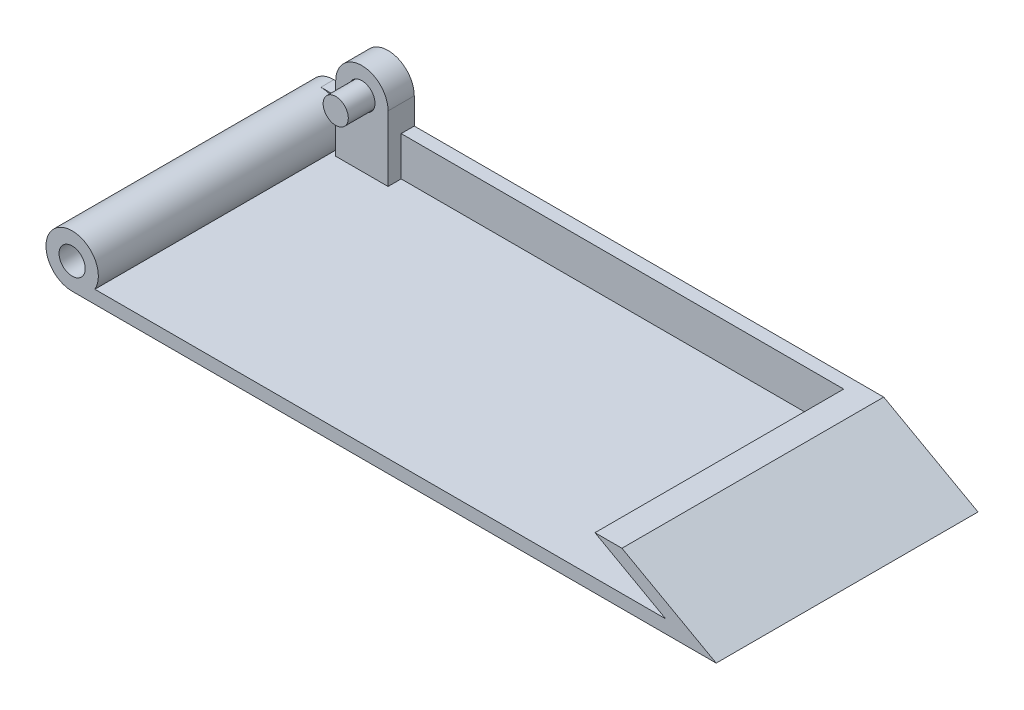
ISO-10303-21;
HEADER;
FILE_DESCRIPTION(('STEP AP214'),'2;1');
FILE_NAME('part.step','',(''),(''),'','','');
FILE_SCHEMA(('AUTOMOTIVE_DESIGN { 1 0 10303 214 1 1 1 1 }'));
ENDSEC;
DATA;
#1=APPLICATION_CONTEXT('core data for automotive mechanical design processes');
#2=APPLICATION_PROTOCOL_DEFINITION('international standard','automotive_design',2000,#1);
#3=PRODUCT_CONTEXT('',#1,'mechanical');
#4=PRODUCT('Part','Part','',(#3));
#5=PRODUCT_RELATED_PRODUCT_CATEGORY('part','',(#4));
#6=PRODUCT_DEFINITION_FORMATION('','',#4);
#7=PRODUCT_DEFINITION_CONTEXT('part definition',#1,'design');
#8=PRODUCT_DEFINITION('design','',#6,#7);
#9=PRODUCT_DEFINITION_SHAPE('','',#8);
#10=(LENGTH_UNIT() NAMED_UNIT(*) SI_UNIT(.MILLI.,.METRE.));
#11=(NAMED_UNIT(*) PLANE_ANGLE_UNIT() SI_UNIT($,.RADIAN.));
#12=(NAMED_UNIT(*) SI_UNIT($,.STERADIAN.) SOLID_ANGLE_UNIT());
#13=UNCERTAINTY_MEASURE_WITH_UNIT(LENGTH_MEASURE(1.E-05),#10,'distance_accuracy_value','');
#14=(GEOMETRIC_REPRESENTATION_CONTEXT(3) GLOBAL_UNCERTAINTY_ASSIGNED_CONTEXT((#13)) GLOBAL_UNIT_ASSIGNED_CONTEXT((#10,
#11,#12)) REPRESENTATION_CONTEXT('',''));
#15=CARTESIAN_POINT('',(0.,0.,0.));
#16=DIRECTION('',(0.,0.,1.));
#17=DIRECTION('',(1.,0.,0.));
#18=AXIS2_PLACEMENT_3D('',#15,#16,#17);
#19=CARTESIAN_POINT('',(10.3363442521382,10.,10.));
#20=DIRECTION('',(0.,0.,1.));
#21=DIRECTION('',(1.,0.,0.));
#22=AXIS2_PLACEMENT_3D('',#19,#20,#21);
#23=PLANE('',#22);
#24=CARTESIAN_POINT('',(10.3363442521382,10.,10.));
#25=DIRECTION('',(0.,0.,-1.));
#26=DIRECTION('',(1.,0.,0.));
#27=AXIS2_PLACEMENT_3D('',#24,#25,#26);
#28=CIRCLE('',#27,2.4);
#29=CARTESIAN_POINT('',(7.93634425213825,10.,10.));
#30=VERTEX_POINT('',#29);
#31=EDGE_CURVE('P0_E21',#30,#30,#28,.T.);
#32=ORIENTED_EDGE('',*,*,#31,.F.);
#33=EDGE_LOOP('',(#32));
#34=FACE_BOUND('',#33,.T.);
#35=ADVANCED_FACE('P0_F17',(#34),#23,.T.);
#36=CARTESIAN_POINT('',(10.3363442521382,10.,0.));
#37=DIRECTION('',(0.,0.,1.));
#38=DIRECTION('',(1.,0.,0.));
#39=AXIS2_PLACEMENT_3D('',#36,#37,#38);
#40=PLANE('',#39);
#41=CARTESIAN_POINT('',(10.3363442521382,10.,0.));
#42=DIRECTION('',(0.,0.,1.));
#43=DIRECTION('',(1.,0.,0.));
#44=AXIS2_PLACEMENT_3D('',#41,#42,#43);
#45=CIRCLE('',#44,2.4);
#46=CARTESIAN_POINT('',(7.93634425213825,10.,0.));
#47=VERTEX_POINT('',#46);
#48=EDGE_CURVE('P0_E11',#47,#47,#45,.T.);
#49=ORIENTED_EDGE('',*,*,#48,.F.);
#50=EDGE_LOOP('',(#49));
#51=FACE_BOUND('',#50,.T.);
#52=ADVANCED_FACE('P0_F55',(#51),#40,.F.);
#53=CARTESIAN_POINT('',(10.3363442521382,10.,0.));
#54=DIRECTION('',(0.,0.,1.));
#55=DIRECTION('',(1.,0.,0.));
#56=AXIS2_PLACEMENT_3D('',#53,#54,#55);
#57=CYLINDRICAL_SURFACE('',#56,2.4);
#58=ORIENTED_EDGE('',*,*,#48,.T.);
#59=EDGE_LOOP('',(#58));
#60=FACE_BOUND('',#59,.T.);
#61=ORIENTED_EDGE('',*,*,#31,.T.);
#62=EDGE_LOOP('',(#61));
#63=FACE_BOUND('',#62,.T.);
#64=ADVANCED_FACE('P0_F19',(#60,#63),#57,.T.);
#65=CLOSED_SHELL('',(#35,#52,#64));
#66=MANIFOLD_SOLID_BREP('P0_B1',#65);
#67=CARTESIAN_POINT('',(59.,0.,50.));
#68=DIRECTION('',(0.,0.,1.));
#69=DIRECTION('',(1.,0.,0.));
#70=AXIS2_PLACEMENT_3D('',#67,#68,#69);
#71=PLANE('',#70);
#72=CARTESIAN_POINT('',(0.,0.,50.));
#73=DIRECTION('',(0.,0.,-1.));
#74=DIRECTION('',(-1.,0.,0.));
#75=AXIS2_PLACEMENT_3D('',#72,#73,#74);
#76=CIRCLE('',#75,2.5);
#77=CARTESIAN_POINT('',(2.5,0.,50.));
#78=VERTEX_POINT('',#77);
#79=EDGE_CURVE('P1_E10',#78,#78,#76,.T.);
#80=ORIENTED_EDGE('',*,*,#79,.T.);
#81=EDGE_LOOP('',(#80));
#82=FACE_BOUND('',#81,.T.);
#83=CARTESIAN_POINT('',(0.,0.,50.));
#84=DIRECTION('',(0.,0.,1.));
#85=DIRECTION('',(-0.86602540378444,0.5,0.));
#86=AXIS2_PLACEMENT_3D('',#83,#84,#85);
#87=CIRCLE('',#86,5.);
#88=CARTESIAN_POINT('',(4.3301270189222,-2.5,50.));
#89=VERTEX_POINT('',#88);
#90=CARTESIAN_POINT('',(0.,-5.,50.));
#91=VERTEX_POINT('',#90);
#92=EDGE_CURVE('P1_E248',#89,#91,#87,.T.);
#93=ORIENTED_EDGE('',*,*,#92,.T.);
#94=DIRECTION('',(-1.,0.,0.));
#95=VECTOR('',#94,1.);
#96=CARTESIAN_POINT('',(123.,-5.,50.));
#97=LINE('',#96,#95);
#98=CARTESIAN_POINT('',(123.,-5.,50.));
#99=VERTEX_POINT('',#98);
#100=EDGE_CURVE('P1_E292',#99,#91,#97,.T.);
#101=ORIENTED_EDGE('',*,*,#100,.F.);
#102=DIRECTION('',(-0.874157276121538,0.485642931178632,0.));
#103=VECTOR('',#102,1.);
#104=CARTESIAN_POINT('',(123.,-5.,50.));
#105=LINE('',#104,#103);
#106=CARTESIAN_POINT('',(105.,5.,50.));
#107=VERTEX_POINT('',#106);
#108=EDGE_CURVE('P1_E200',#99,#107,#105,.T.);
#109=ORIENTED_EDGE('',*,*,#108,.T.);
#110=DIRECTION('',(1.,0.,0.));
#111=VECTOR('',#110,1.);
#112=CARTESIAN_POINT('',(99.8521849295065,5.,50.));
#113=LINE('',#112,#111);
#114=CARTESIAN_POINT('',(99.8521849295065,5.,50.));
#115=VERTEX_POINT('',#114);
#116=EDGE_CURVE('P1_E213',#115,#107,#113,.T.);
#117=ORIENTED_EDGE('',*,*,#116,.F.);
#118=DIRECTION('',(0.874157276121538,-0.485642931178632,0.));
#119=VECTOR('',#118,1.);
#120=CARTESIAN_POINT('',(99.8521849295065,5.,50.));
#121=LINE('',#120,#119);
#122=CARTESIAN_POINT('',(113.352184929506,-2.5,50.));
#123=VERTEX_POINT('',#122);
#124=EDGE_CURVE('P1_E293',#115,#123,#121,.T.);
#125=ORIENTED_EDGE('',*,*,#124,.T.);
#126=DIRECTION('',(-1.,0.,0.));
#127=VECTOR('',#126,1.);
#128=CARTESIAN_POINT('',(113.352184929506,-2.5,50.));
#129=LINE('',#128,#127);
#130=EDGE_CURVE('P1_E235',#123,#89,#129,.T.);
#131=ORIENTED_EDGE('',*,*,#130,.T.);
#132=EDGE_LOOP('',(#93,#101,#109,#117,#125,#131));
#133=FACE_BOUND('',#132,.T.);
#134=ADVANCED_FACE('P1_F16',(#82,#133),#71,.T.);
#135=CARTESIAN_POINT('',(0.,0.,0.));
#136=DIRECTION('',(0.,0.,1.));
#137=DIRECTION('',(-1.,0.,0.));
#138=AXIS2_PLACEMENT_3D('',#135,#136,#137);
#139=CYLINDRICAL_SURFACE('',#138,2.5);
#140=CARTESIAN_POINT('',(0.,0.,0.));
#141=DIRECTION('',(0.,0.,1.));
#142=DIRECTION('',(-1.,0.,0.));
#143=AXIS2_PLACEMENT_3D('',#140,#141,#142);
#144=CIRCLE('',#143,2.5);
#145=CARTESIAN_POINT('',(2.5,0.,0.));
#146=VERTEX_POINT('',#145);
#147=EDGE_CURVE('P1_E240',#146,#146,#144,.T.);
#148=ORIENTED_EDGE('',*,*,#147,.F.);
#149=EDGE_LOOP('',(#148));
#150=FACE_BOUND('',#149,.T.);
#151=ORIENTED_EDGE('',*,*,#79,.F.);
#152=EDGE_LOOP('',(#151));
#153=FACE_BOUND('',#152,.T.);
#154=ADVANCED_FACE('P1_F487',(#150,#153),#139,.F.);
#155=CARTESIAN_POINT('',(10.3363442521382,10.,5.));
#156=DIRECTION('',(0.,0.,1.));
#157=DIRECTION('',(1.,0.,0.));
#158=AXIS2_PLACEMENT_3D('',#155,#156,#157);
#159=PLANE('',#158);
#160=CARTESIAN_POINT('',(10.3363442521382,10.,5.));
#161=DIRECTION('',(0.,0.,-1.));
#162=DIRECTION('',(1.,0.,0.));
#163=AXIS2_PLACEMENT_3D('',#160,#161,#162);
#164=CIRCLE('',#163,2.5);
#165=CARTESIAN_POINT('',(7.83634425213825,10.,5.));
#166=VERTEX_POINT('',#165);
#167=EDGE_CURVE('P1_E197',#166,#166,#164,.T.);
#168=ORIENTED_EDGE('',*,*,#167,.T.);
#169=EDGE_LOOP('',(#168));
#170=FACE_BOUND('',#169,.T.);
#171=CARTESIAN_POINT('',(10.3363442521382,10.,5.));
#172=DIRECTION('',(0.,0.,-1.));
#173=DIRECTION('',(0.707106781186547,0.707106781186548,0.));
#174=AXIS2_PLACEMENT_3D('',#171,#172,#173);
#175=CIRCLE('',#174,5.);
#176=CARTESIAN_POINT('',(5.33634425213825,10.,5.));
#177=VERTEX_POINT('',#176);
#178=CARTESIAN_POINT('',(15.3363442521383,10.,5.));
#179=VERTEX_POINT('',#178);
#180=EDGE_CURVE('P1_E151',#177,#179,#175,.T.);
#181=ORIENTED_EDGE('',*,*,#180,.F.);
#182=DIRECTION('',(0.,1.,0.));
#183=VECTOR('',#182,1.);
#184=CARTESIAN_POINT('',(5.33634425213824,-2.5,5.));
#185=LINE('',#184,#183);
#186=CARTESIAN_POINT('',(5.33634425213824,-2.5,5.));
#187=VERTEX_POINT('',#186);
#188=EDGE_CURVE('P1_E245',#187,#177,#185,.T.);
#189=ORIENTED_EDGE('',*,*,#188,.F.);
#190=DIRECTION('',(-1.,0.,0.));
#191=VECTOR('',#190,1.);
#192=CARTESIAN_POINT('',(15.3363442521383,-2.5,5.));
#193=LINE('',#192,#191);
#194=CARTESIAN_POINT('',(15.3363442521383,-2.5,5.));
#195=VERTEX_POINT('',#194);
#196=EDGE_CURVE('P1_E196',#195,#187,#193,.T.);
#197=ORIENTED_EDGE('',*,*,#196,.F.);
#198=DIRECTION('',(0.,-1.,0.));
#199=VECTOR('',#198,1.);
#200=CARTESIAN_POINT('',(15.3363442521383,10.,5.));
#201=LINE('',#200,#199);
#202=EDGE_CURVE('P1_E26',#179,#195,#201,.T.);
#203=ORIENTED_EDGE('',*,*,#202,.F.);
#204=EDGE_LOOP('',(#181,#189,#197,#203));
#205=FACE_BOUND('',#204,.T.);
#206=ADVANCED_FACE('P1_F319',(#170,#205),#159,.T.);
#207=CARTESIAN_POINT('',(15.3363442521383,15.,0.));
#208=DIRECTION('',(1.,0.,0.));
#209=DIRECTION('',(0.,1.,0.));
#210=AXIS2_PLACEMENT_3D('',#207,#208,#209);
#211=PLANE('',#210);
#212=DIRECTION('',(0.,0.,-1.));
#213=VECTOR('',#212,1.);
#214=CARTESIAN_POINT('',(15.3363442521383,10.,5.));
#215=LINE('',#214,#213);
#216=CARTESIAN_POINT('',(15.3363442521383,10.,0.));
#217=VERTEX_POINT('',#216);
#218=EDGE_CURVE('P1_E144',#179,#217,#215,.T.);
#219=ORIENTED_EDGE('',*,*,#218,.F.);
#220=ORIENTED_EDGE('',*,*,#202,.T.);
#221=DIRECTION('',(0.,0.,1.));
#222=VECTOR('',#221,1.);
#223=CARTESIAN_POINT('',(15.3363442521383,-2.5,2.5));
#224=LINE('',#223,#222);
#225=CARTESIAN_POINT('',(15.3363442521383,-2.5,2.5));
#226=VERTEX_POINT('',#225);
#227=EDGE_CURVE('P1_E231',#226,#195,#224,.T.);
#228=ORIENTED_EDGE('',*,*,#227,.F.);
#229=DIRECTION('',(0.,-1.,0.));
#230=VECTOR('',#229,1.);
#231=CARTESIAN_POINT('',(15.3363442521383,5.,2.5));
#232=LINE('',#231,#230);
#233=CARTESIAN_POINT('',(15.3363442521383,5.,2.5));
#234=VERTEX_POINT('',#233);
#235=EDGE_CURVE('P1_E261',#234,#226,#232,.T.);
#236=ORIENTED_EDGE('',*,*,#235,.F.);
#237=DIRECTION('',(0.,0.,1.));
#238=VECTOR('',#237,1.);
#239=CARTESIAN_POINT('',(15.3363442521383,5.,0.));
#240=LINE('',#239,#238);
#241=CARTESIAN_POINT('',(15.3363442521383,5.,0.));
#242=VERTEX_POINT('',#241);
#243=EDGE_CURVE('P1_E160',#242,#234,#240,.T.);
#244=ORIENTED_EDGE('',*,*,#243,.F.);
#245=DIRECTION('',(0.,1.,0.));
#246=VECTOR('',#245,1.);
#247=CARTESIAN_POINT('',(15.3363442521383,5.,0.));
#248=LINE('',#247,#246);
#249=EDGE_CURVE('P1_E157',#242,#217,#248,.T.);
#250=ORIENTED_EDGE('',*,*,#249,.T.);
#251=EDGE_LOOP('',(#219,#220,#228,#236,#244,#250));
#252=FACE_BOUND('',#251,.T.);
#253=ADVANCED_FACE('P1_F158',(#252),#211,.T.);
#254=CARTESIAN_POINT('',(10.3363442521382,10.,0.));
#255=DIRECTION('',(0.,0.,1.));
#256=DIRECTION('',(1.,0.,0.));
#257=AXIS2_PLACEMENT_3D('',#254,#255,#256);
#258=CYLINDRICAL_SURFACE('',#257,2.5);
#259=CARTESIAN_POINT('',(10.3363442521382,10.,0.));
#260=DIRECTION('',(0.,0.,1.));
#261=DIRECTION('',(1.,0.,0.));
#262=AXIS2_PLACEMENT_3D('',#259,#260,#261);
#263=CIRCLE('',#262,2.5);
#264=CARTESIAN_POINT('',(7.83634425213825,10.,0.));
#265=VERTEX_POINT('',#264);
#266=EDGE_CURVE('P1_E246',#265,#265,#263,.T.);
#267=ORIENTED_EDGE('',*,*,#266,.F.);
#268=EDGE_LOOP('',(#267));
#269=FACE_BOUND('',#268,.T.);
#270=ORIENTED_EDGE('',*,*,#167,.F.);
#271=EDGE_LOOP('',(#270));
#272=FACE_BOUND('',#271,.T.);
#273=ADVANCED_FACE('P1_F508',(#269,#272),#258,.F.);
#274=CARTESIAN_POINT('',(105.,5.,50.));
#275=DIRECTION('',(-0.485642931178631,-0.874157276121538,0.));
#276=DIRECTION('',(-0.874157276121538,0.485642931178631,0.));
#277=AXIS2_PLACEMENT_3D('',#274,#275,#276);
#278=PLANE('',#277);
#279=DIRECTION('',(0.874157276121538,-0.485642931178632,0.));
#280=VECTOR('',#279,1.);
#281=CARTESIAN_POINT('',(105.,5.,0.));
#282=LINE('',#281,#280);
#283=CARTESIAN_POINT('',(105.,5.,0.));
#284=VERTEX_POINT('',#283);
#285=CARTESIAN_POINT('',(123.,-5.,0.));
#286=VERTEX_POINT('',#285);
#287=EDGE_CURVE('P1_E165',#284,#286,#282,.T.);
#288=ORIENTED_EDGE('',*,*,#287,.F.);
#289=DIRECTION('',(0.,0.,-1.));
#290=VECTOR('',#289,1.);
#291=CARTESIAN_POINT('',(105.,5.,50.));
#292=LINE('',#291,#290);
#293=EDGE_CURVE('P1_E208',#107,#284,#292,.T.);
#294=ORIENTED_EDGE('',*,*,#293,.F.);
#295=ORIENTED_EDGE('',*,*,#108,.F.);
#296=DIRECTION('',(0.,0.,1.));
#297=VECTOR('',#296,1.);
#298=CARTESIAN_POINT('',(123.,-5.,0.));
#299=LINE('',#298,#297);
#300=EDGE_CURVE('P1_E288',#286,#99,#299,.T.);
#301=ORIENTED_EDGE('',*,*,#300,.F.);
#302=EDGE_LOOP('',(#288,#294,#295,#301));
#303=FACE_BOUND('',#302,.T.);
#304=ADVANCED_FACE('P1_F465',(#303),#278,.F.);
#305=CARTESIAN_POINT('',(5.33634425213824,5.,0.));
#306=DIRECTION('',(-1.,0.,0.));
#307=DIRECTION('',(0.,0.,1.));
#308=AXIS2_PLACEMENT_3D('',#305,#306,#307);
#309=PLANE('',#308);
#310=DIRECTION('',(0.,0.,1.));
#311=VECTOR('',#310,1.);
#312=CARTESIAN_POINT('',(5.33634425213825,10.,0.));
#313=LINE('',#312,#311);
#314=CARTESIAN_POINT('',(5.33634425213825,10.,0.));
#315=VERTEX_POINT('',#314);
#316=EDGE_CURVE('P1_E154',#315,#177,#313,.T.);
#317=ORIENTED_EDGE('',*,*,#316,.F.);
#318=DIRECTION('',(0.,-1.,0.));
#319=VECTOR('',#318,1.);
#320=CARTESIAN_POINT('',(5.33634425213825,10.,0.));
#321=LINE('',#320,#319);
#322=CARTESIAN_POINT('',(5.33634425213824,5.,0.));
#323=VERTEX_POINT('',#322);
#324=EDGE_CURVE('P1_E170',#315,#323,#321,.T.);
#325=ORIENTED_EDGE('',*,*,#324,.T.);
#326=DIRECTION('',(0.,0.,-1.));
#327=VECTOR('',#326,1.);
#328=CARTESIAN_POINT('',(5.33634425213824,5.,2.5));
#329=LINE('',#328,#327);
#330=CARTESIAN_POINT('',(5.33634425213824,5.,2.5));
#331=VERTEX_POINT('',#330);
#332=EDGE_CURVE('P1_E214',#331,#323,#329,.T.);
#333=ORIENTED_EDGE('',*,*,#332,.F.);
#334=DIRECTION('',(0.,1.,0.));
#335=VECTOR('',#334,1.);
#336=CARTESIAN_POINT('',(5.33634425213824,-2.5,2.5));
#337=LINE('',#336,#335);
#338=CARTESIAN_POINT('',(5.33634425213824,-2.5,2.5));
#339=VERTEX_POINT('',#338);
#340=EDGE_CURVE('P1_E191',#339,#331,#337,.T.);
#341=ORIENTED_EDGE('',*,*,#340,.F.);
#342=DIRECTION('',(0.,0.,-1.));
#343=VECTOR('',#342,1.);
#344=CARTESIAN_POINT('',(5.33634425213824,-2.5,5.));
#345=LINE('',#344,#343);
#346=EDGE_CURVE('P1_E183',#187,#339,#345,.T.);
#347=ORIENTED_EDGE('',*,*,#346,.F.);
#348=ORIENTED_EDGE('',*,*,#188,.T.);
#349=EDGE_LOOP('',(#317,#325,#333,#341,#347,#348));
#350=FACE_BOUND('',#349,.T.);
#351=ADVANCED_FACE('P1_F469',(#350),#309,.T.);
#352=CARTESIAN_POINT('',(10.3363442521382,10.,0.));
#353=DIRECTION('',(0.,0.,1.));
#354=DIRECTION('',(-0.707106781186548,0.707106781186547,0.));
#355=AXIS2_PLACEMENT_3D('',#352,#353,#354);
#356=CYLINDRICAL_SURFACE('',#355,5.);
#357=ORIENTED_EDGE('',*,*,#180,.T.);
#358=ORIENTED_EDGE('',*,*,#218,.T.);
#359=CARTESIAN_POINT('',(10.3363442521382,10.,0.));
#360=DIRECTION('',(0.,0.,1.));
#361=DIRECTION('',(-0.707106781186548,0.707106781186547,0.));
#362=AXIS2_PLACEMENT_3D('',#359,#360,#361);
#363=CIRCLE('',#362,5.);
#364=EDGE_CURVE('P1_E149',#217,#315,#363,.T.);
#365=ORIENTED_EDGE('',*,*,#364,.T.);
#366=ORIENTED_EDGE('',*,*,#316,.T.);
#367=EDGE_LOOP('',(#357,#358,#365,#366));
#368=FACE_BOUND('',#367,.T.);
#369=ADVANCED_FACE('P1_F146',(#368),#356,.T.);
#370=CARTESIAN_POINT('',(0.,0.,0.));
#371=DIRECTION('',(0.,0.,1.));
#372=DIRECTION('',(-0.707106781186548,0.707106781186548,0.));
#373=AXIS2_PLACEMENT_3D('',#370,#371,#372);
#374=CYLINDRICAL_SURFACE('',#373,5.);
#375=ORIENTED_EDGE('',*,*,#92,.F.);
#376=DIRECTION('',(0.,0.,-1.));
#377=VECTOR('',#376,1.);
#378=CARTESIAN_POINT('',(4.3301270189222,-2.5,50.));
#379=LINE('',#378,#377);
#380=CARTESIAN_POINT('',(4.3301270189222,-2.5,2.5));
#381=VERTEX_POINT('',#380);
#382=EDGE_CURVE('P1_E278',#89,#381,#379,.T.);
#383=ORIENTED_EDGE('',*,*,#382,.T.);
#384=CARTESIAN_POINT('',(0.,0.,2.5));
#385=DIRECTION('',(0.,0.,-1.));
#386=DIRECTION('',(-0.86602540378444,0.5,0.));
#387=AXIS2_PLACEMENT_3D('',#384,#385,#386);
#388=CIRCLE('',#387,5.);
#389=CARTESIAN_POINT('',(0.,5.,2.5));
#390=VERTEX_POINT('',#389);
#391=EDGE_CURVE('P1_E207',#390,#381,#388,.T.);
#392=ORIENTED_EDGE('',*,*,#391,.F.);
#393=DIRECTION('',(0.,0.,-1.));
#394=VECTOR('',#393,1.);
#395=CARTESIAN_POINT('',(0.,5.,2.5));
#396=LINE('',#395,#394);
#397=CARTESIAN_POINT('',(0.,5.,0.));
#398=VERTEX_POINT('',#397);
#399=EDGE_CURVE('P1_E172',#390,#398,#396,.T.);
#400=ORIENTED_EDGE('',*,*,#399,.T.);
#401=CARTESIAN_POINT('',(0.,0.,0.));
#402=DIRECTION('',(0.,0.,1.));
#403=DIRECTION('',(-0.707106781186548,0.707106781186548,0.));
#404=AXIS2_PLACEMENT_3D('',#401,#402,#403);
#405=CIRCLE('',#404,5.);
#406=CARTESIAN_POINT('',(0.,-5.,0.));
#407=VERTEX_POINT('',#406);
#408=EDGE_CURVE('P1_E203',#398,#407,#405,.T.);
#409=ORIENTED_EDGE('',*,*,#408,.T.);
#410=DIRECTION('',(0.,0.,1.));
#411=VECTOR('',#410,1.);
#412=CARTESIAN_POINT('',(0.,-5.,0.));
#413=LINE('',#412,#411);
#414=EDGE_CURVE('P1_E185',#407,#91,#413,.T.);
#415=ORIENTED_EDGE('',*,*,#414,.T.);
#416=EDGE_LOOP('',(#375,#383,#392,#400,#409,#415));
#417=FACE_BOUND('',#416,.T.);
#418=ADVANCED_FACE('P1_F456',(#417),#374,.T.);
#419=CARTESIAN_POINT('',(59.,0.,0.));
#420=DIRECTION('',(0.,0.,1.));
#421=DIRECTION('',(1.,0.,0.));
#422=AXIS2_PLACEMENT_3D('',#419,#420,#421);
#423=PLANE('',#422);
#424=ORIENTED_EDGE('',*,*,#266,.T.);
#425=EDGE_LOOP('',(#424));
#426=FACE_BOUND('',#425,.T.);
#427=ORIENTED_EDGE('',*,*,#147,.T.);
#428=EDGE_LOOP('',(#427));
#429=FACE_BOUND('',#428,.T.);
#430=ORIENTED_EDGE('',*,*,#364,.F.);
#431=ORIENTED_EDGE('',*,*,#249,.F.);
#432=DIRECTION('',(1.,0.,0.));
#433=VECTOR('',#432,1.);
#434=CARTESIAN_POINT('',(15.3363442521383,5.,0.));
#435=LINE('',#434,#433);
#436=EDGE_CURVE('P1_E212',#242,#284,#435,.T.);
#437=ORIENTED_EDGE('',*,*,#436,.T.);
#438=ORIENTED_EDGE('',*,*,#287,.T.);
#439=DIRECTION('',(-1.,0.,0.));
#440=VECTOR('',#439,1.);
#441=CARTESIAN_POINT('',(123.,-5.,0.));
#442=LINE('',#441,#440);
#443=EDGE_CURVE('P1_E188',#286,#407,#442,.T.);
#444=ORIENTED_EDGE('',*,*,#443,.T.);
#445=ORIENTED_EDGE('',*,*,#408,.F.);
#446=DIRECTION('',(1.,0.,0.));
#447=VECTOR('',#446,1.);
#448=CARTESIAN_POINT('',(0.,5.,0.));
#449=LINE('',#448,#447);
#450=EDGE_CURVE('P1_E179',#398,#323,#449,.T.);
#451=ORIENTED_EDGE('',*,*,#450,.T.);
#452=ORIENTED_EDGE('',*,*,#324,.F.);
#453=EDGE_LOOP('',(#430,#431,#437,#438,#444,#445,#451,#452));
#454=FACE_BOUND('',#453,.T.);
#455=ADVANCED_FACE('P1_F168',(#426,#429,#454),#423,.F.);
#456=CARTESIAN_POINT('',(-5.,5.,0.));
#457=DIRECTION('',(0.,1.,0.));
#458=DIRECTION('',(1.,0.,0.));
#459=AXIS2_PLACEMENT_3D('',#456,#457,#458);
#460=PLANE('',#459);
#461=DIRECTION('',(1.,0.,0.));
#462=VECTOR('',#461,1.);
#463=CARTESIAN_POINT('',(0.,5.,2.5));
#464=LINE('',#463,#462);
#465=EDGE_CURVE('P1_E195',#390,#331,#464,.T.);
#466=ORIENTED_EDGE('',*,*,#465,.T.);
#467=ORIENTED_EDGE('',*,*,#332,.T.);
#468=ORIENTED_EDGE('',*,*,#450,.F.);
#469=ORIENTED_EDGE('',*,*,#399,.F.);
#470=EDGE_LOOP('',(#466,#467,#468,#469));
#471=FACE_BOUND('',#470,.T.);
#472=ADVANCED_FACE('P1_F474',(#471),#460,.T.);
#473=CARTESIAN_POINT('',(-5.,5.,0.));
#474=DIRECTION('',(0.,1.,0.));
#475=DIRECTION('',(1.,0.,0.));
#476=AXIS2_PLACEMENT_3D('',#473,#474,#475);
#477=PLANE('',#476);
#478=DIRECTION('',(0.,0.,1.));
#479=VECTOR('',#478,1.);
#480=CARTESIAN_POINT('',(99.8521849295065,5.,2.5));
#481=LINE('',#480,#479);
#482=CARTESIAN_POINT('',(99.8521849295065,5.,2.5));
#483=VERTEX_POINT('',#482);
#484=EDGE_CURVE('P1_E19',#483,#115,#481,.T.);
#485=ORIENTED_EDGE('',*,*,#484,.T.);
#486=ORIENTED_EDGE('',*,*,#116,.T.);
#487=ORIENTED_EDGE('',*,*,#293,.T.);
#488=ORIENTED_EDGE('',*,*,#436,.F.);
#489=ORIENTED_EDGE('',*,*,#243,.T.);
#490=DIRECTION('',(1.,0.,0.));
#491=VECTOR('',#490,1.);
#492=CARTESIAN_POINT('',(15.3363442521383,5.,2.5));
#493=LINE('',#492,#491);
#494=EDGE_CURVE('P1_E189',#234,#483,#493,.T.);
#495=ORIENTED_EDGE('',*,*,#494,.T.);
#496=EDGE_LOOP('',(#485,#486,#487,#488,#489,#495));
#497=FACE_BOUND('',#496,.T.);
#498=ADVANCED_FACE('P1_F256',(#497),#477,.T.);
#499=CARTESIAN_POINT('',(55.7202794743233,1.13638085779794,2.5));
#500=DIRECTION('',(0.,0.,1.));
#501=DIRECTION('',(1.,0.,0.));
#502=AXIS2_PLACEMENT_3D('',#499,#500,#501);
#503=PLANE('',#502);
#504=ORIENTED_EDGE('',*,*,#340,.T.);
#505=ORIENTED_EDGE('',*,*,#465,.F.);
#506=ORIENTED_EDGE('',*,*,#391,.T.);
#507=DIRECTION('',(1.,0.,0.));
#508=VECTOR('',#507,1.);
#509=CARTESIAN_POINT('',(4.3301270189222,-2.5,2.5));
#510=LINE('',#509,#508);
#511=EDGE_CURVE('P1_E274',#381,#339,#510,.T.);
#512=ORIENTED_EDGE('',*,*,#511,.T.);
#513=EDGE_LOOP('',(#504,#505,#506,#512));
#514=FACE_BOUND('',#513,.T.);
#515=ADVANCED_FACE('P1_F472',(#514),#503,.T.);
#516=CARTESIAN_POINT('',(4.3301270189222,-2.5,50.));
#517=DIRECTION('',(0.,-1.,0.));
#518=DIRECTION('',(0.,0.,-1.));
#519=AXIS2_PLACEMENT_3D('',#516,#517,#518);
#520=PLANE('',#519);
#521=ORIENTED_EDGE('',*,*,#346,.T.);
#522=ORIENTED_EDGE('',*,*,#511,.F.);
#523=ORIENTED_EDGE('',*,*,#382,.F.);
#524=ORIENTED_EDGE('',*,*,#130,.F.);
#525=DIRECTION('',(0.,0.,-1.));
#526=VECTOR('',#525,1.);
#527=CARTESIAN_POINT('',(113.352184929506,-2.5,50.));
#528=LINE('',#527,#526);
#529=CARTESIAN_POINT('',(113.352184929506,-2.5,2.5));
#530=VERTEX_POINT('',#529);
#531=EDGE_CURVE('P1_E297',#123,#530,#528,.T.);
#532=ORIENTED_EDGE('',*,*,#531,.T.);
#533=DIRECTION('',(1.,0.,0.));
#534=VECTOR('',#533,1.);
#535=CARTESIAN_POINT('',(15.3363442521383,-2.5,2.5));
#536=LINE('',#535,#534);
#537=EDGE_CURVE('P1_E222',#226,#530,#536,.T.);
#538=ORIENTED_EDGE('',*,*,#537,.F.);
#539=ORIENTED_EDGE('',*,*,#227,.T.);
#540=ORIENTED_EDGE('',*,*,#196,.T.);
#541=EDGE_LOOP('',(#521,#522,#523,#524,#532,#538,#539,#540));
#542=FACE_BOUND('',#541,.T.);
#543=ADVANCED_FACE('P1_F453',(#542),#520,.F.);
#544=CARTESIAN_POINT('',(113.352184929506,-2.5,50.));
#545=DIRECTION('',(0.485642931178632,0.874157276121538,0.));
#546=DIRECTION('',(0.,0.,-1.));
#547=AXIS2_PLACEMENT_3D('',#544,#545,#546);
#548=PLANE('',#547);
#549=DIRECTION('',(-0.874157276121538,0.485642931178632,0.));
#550=VECTOR('',#549,1.);
#551=CARTESIAN_POINT('',(113.352184929506,-2.5,2.5));
#552=LINE('',#551,#550);
#553=EDGE_CURVE('P1_E218',#530,#483,#552,.T.);
#554=ORIENTED_EDGE('',*,*,#553,.F.);
#555=ORIENTED_EDGE('',*,*,#531,.F.);
#556=ORIENTED_EDGE('',*,*,#124,.F.);
#557=ORIENTED_EDGE('',*,*,#484,.F.);
#558=EDGE_LOOP('',(#554,#555,#556,#557));
#559=FACE_BOUND('',#558,.T.);
#560=ADVANCED_FACE('P1_F467',(#559),#548,.F.);
#561=CARTESIAN_POINT('',(123.,-5.,0.));
#562=DIRECTION('',(0.,-1.,0.));
#563=DIRECTION('',(0.,0.,-1.));
#564=AXIS2_PLACEMENT_3D('',#561,#562,#563);
#565=PLANE('',#564);
#566=ORIENTED_EDGE('',*,*,#414,.F.);
#567=ORIENTED_EDGE('',*,*,#443,.F.);
#568=ORIENTED_EDGE('',*,*,#300,.T.);
#569=ORIENTED_EDGE('',*,*,#100,.T.);
#570=EDGE_LOOP('',(#566,#567,#568,#569));
#571=FACE_BOUND('',#570,.T.);
#572=ADVANCED_FACE('P1_F461',(#571),#565,.T.);
#573=CARTESIAN_POINT('',(55.7202794743233,1.13638085779794,2.5));
#574=DIRECTION('',(0.,0.,1.));
#575=DIRECTION('',(1.,0.,0.));
#576=AXIS2_PLACEMENT_3D('',#573,#574,#575);
#577=PLANE('',#576);
#578=ORIENTED_EDGE('',*,*,#235,.T.);
#579=ORIENTED_EDGE('',*,*,#537,.T.);
#580=ORIENTED_EDGE('',*,*,#553,.T.);
#581=ORIENTED_EDGE('',*,*,#494,.F.);
#582=EDGE_LOOP('',(#578,#579,#580,#581));
#583=FACE_BOUND('',#582,.T.);
#584=ADVANCED_FACE('P1_F259',(#583),#577,.T.);
#585=CLOSED_SHELL('',(#134,#154,#206,#253,#273,#304,#351,#369,#418,#455,#472,#498,#515,#543,
#560,#572,#584));
#586=MANIFOLD_SOLID_BREP('P1_B1',#585);
#587=ADVANCED_BREP_SHAPE_REPRESENTATION('',(#18,#66,#586),#14);
#588=SHAPE_DEFINITION_REPRESENTATION(#9,#587);
ENDSEC;
END-ISO-10303-21;
